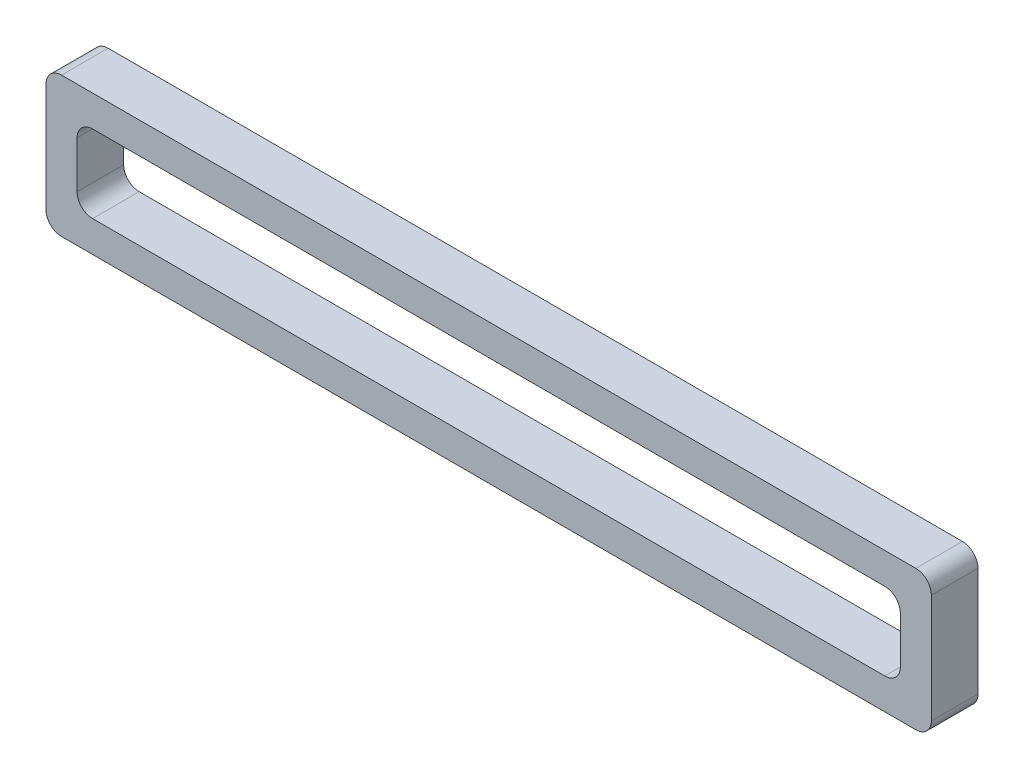
ISO-10303-21;
HEADER;
FILE_DESCRIPTION(('STEP AP214'),'2;1');
FILE_NAME('part.step','',(''),(''),'','','');
FILE_SCHEMA(('AUTOMOTIVE_DESIGN { 1 0 10303 214 1 1 1 1 }'));
ENDSEC;
DATA;
#1=APPLICATION_CONTEXT('core data for automotive mechanical design processes');
#2=APPLICATION_PROTOCOL_DEFINITION('international standard','automotive_design',2000,#1);
#3=PRODUCT_CONTEXT('',#1,'mechanical');
#4=PRODUCT('Part','Part','',(#3));
#5=PRODUCT_RELATED_PRODUCT_CATEGORY('part','',(#4));
#6=PRODUCT_DEFINITION_FORMATION('','',#4);
#7=PRODUCT_DEFINITION_CONTEXT('part definition',#1,'design');
#8=PRODUCT_DEFINITION('design','',#6,#7);
#9=PRODUCT_DEFINITION_SHAPE('','',#8);
#10=(LENGTH_UNIT() NAMED_UNIT(*) SI_UNIT(.MILLI.,.METRE.));
#11=(NAMED_UNIT(*) PLANE_ANGLE_UNIT() SI_UNIT($,.RADIAN.));
#12=(NAMED_UNIT(*) SI_UNIT($,.STERADIAN.) SOLID_ANGLE_UNIT());
#13=UNCERTAINTY_MEASURE_WITH_UNIT(LENGTH_MEASURE(1.E-05),#10,'distance_accuracy_value','');
#14=(GEOMETRIC_REPRESENTATION_CONTEXT(3) GLOBAL_UNCERTAINTY_ASSIGNED_CONTEXT((#13)) GLOBAL_UNIT_ASSIGNED_CONTEXT((#10,
#11,#12)) REPRESENTATION_CONTEXT('',''));
#15=CARTESIAN_POINT('',(0.,0.,0.));
#16=DIRECTION('',(0.,0.,1.));
#17=DIRECTION('',(1.,0.,0.));
#18=AXIS2_PLACEMENT_3D('',#15,#16,#17);
#19=CARTESIAN_POINT('',(27.5,-3.5,3.));
#20=DIRECTION('',(0.,0.,1.));
#21=DIRECTION('',(1.,0.,0.));
#22=AXIS2_PLACEMENT_3D('',#19,#20,#21);
#23=PLANE('',#22);
#24=CARTESIAN_POINT('',(27.5,-3.5,3.));
#25=DIRECTION('',(0.,0.,1.));
#26=DIRECTION('',(1.,0.,0.));
#27=AXIS2_PLACEMENT_3D('',#24,#25,#26);
#28=CIRCLE('',#27,0.999999999999997);
#29=CARTESIAN_POINT('',(27.5,-4.5,3.));
#30=VERTEX_POINT('',#29);
#31=CARTESIAN_POINT('',(28.5,-3.5,3.));
#32=VERTEX_POINT('',#31);
#33=EDGE_CURVE('E211',#30,#32,#28,.T.);
#34=ORIENTED_EDGE('',*,*,#33,.T.);
#35=DIRECTION('',(0.,1.,0.));
#36=VECTOR('',#35,1.);
#37=CARTESIAN_POINT('',(28.5,3.5,3.));
#38=LINE('',#37,#36);
#39=CARTESIAN_POINT('',(28.5,3.5,3.));
#40=VERTEX_POINT('',#39);
#41=EDGE_CURVE('E214',#32,#40,#38,.T.);
#42=ORIENTED_EDGE('',*,*,#41,.T.);
#43=CARTESIAN_POINT('',(27.5,3.5,3.));
#44=DIRECTION('',(0.,0.,1.));
#45=DIRECTION('',(-1.,0.,0.));
#46=AXIS2_PLACEMENT_3D('',#43,#44,#45);
#47=CIRCLE('',#46,1.);
#48=CARTESIAN_POINT('',(27.5,4.5,3.));
#49=VERTEX_POINT('',#48);
#50=EDGE_CURVE('E217',#40,#49,#47,.T.);
#51=ORIENTED_EDGE('',*,*,#50,.T.);
#52=DIRECTION('',(-1.,0.,0.));
#53=VECTOR('',#52,1.);
#54=CARTESIAN_POINT('',(-27.5,4.5,3.));
#55=LINE('',#54,#53);
#56=CARTESIAN_POINT('',(-27.5,4.5,3.));
#57=VERTEX_POINT('',#56);
#58=EDGE_CURVE('E219',#49,#57,#55,.T.);
#59=ORIENTED_EDGE('',*,*,#58,.T.);
#60=CARTESIAN_POINT('',(-27.5,3.5,3.));
#61=DIRECTION('',(0.,0.,1.));
#62=DIRECTION('',(1.,0.,0.));
#63=AXIS2_PLACEMENT_3D('',#60,#61,#62);
#64=CIRCLE('',#63,0.999999999999999);
#65=CARTESIAN_POINT('',(-28.5,3.5,3.));
#66=VERTEX_POINT('',#65);
#67=EDGE_CURVE('E221',#57,#66,#64,.T.);
#68=ORIENTED_EDGE('',*,*,#67,.T.);
#69=DIRECTION('',(0.,-1.,0.));
#70=VECTOR('',#69,1.);
#71=CARTESIAN_POINT('',(-28.5,3.5,3.));
#72=LINE('',#71,#70);
#73=CARTESIAN_POINT('',(-28.5,-3.5,3.));
#74=VERTEX_POINT('',#73);
#75=EDGE_CURVE('E223',#66,#74,#72,.T.);
#76=ORIENTED_EDGE('',*,*,#75,.T.);
#77=CARTESIAN_POINT('',(-27.5,-3.5,3.));
#78=DIRECTION('',(0.,0.,1.));
#79=DIRECTION('',(1.,0.,0.));
#80=AXIS2_PLACEMENT_3D('',#77,#78,#79);
#81=CIRCLE('',#80,0.999999999999999);
#82=CARTESIAN_POINT('',(-27.5,-4.5,3.));
#83=VERTEX_POINT('',#82);
#84=EDGE_CURVE('E225',#74,#83,#81,.T.);
#85=ORIENTED_EDGE('',*,*,#84,.T.);
#86=DIRECTION('',(1.,0.,0.));
#87=VECTOR('',#86,1.);
#88=CARTESIAN_POINT('',(-27.5,-4.5,3.));
#89=LINE('',#88,#87);
#90=EDGE_CURVE('E227',#83,#30,#89,.T.);
#91=ORIENTED_EDGE('',*,*,#90,.T.);
#92=EDGE_LOOP('',(#34,#42,#51,#59,#68,#76,#85,#91));
#93=FACE_BOUND('',#92,.T.);
#94=DIRECTION('',(-1.,0.,0.));
#95=VECTOR('',#94,1.);
#96=CARTESIAN_POINT('',(-25.5,2.5,3.));
#97=LINE('',#96,#95);
#98=CARTESIAN_POINT('',(25.5,2.5,3.));
#99=VERTEX_POINT('',#98);
#100=CARTESIAN_POINT('',(-25.5,2.5,3.));
#101=VERTEX_POINT('',#100);
#102=EDGE_CURVE('E154',#99,#101,#97,.T.);
#103=ORIENTED_EDGE('',*,*,#102,.F.);
#104=CARTESIAN_POINT('',(25.5,1.5,3.));
#105=DIRECTION('',(0.,0.,1.));
#106=DIRECTION('',(-1.,0.,0.));
#107=AXIS2_PLACEMENT_3D('',#104,#105,#106);
#108=CIRCLE('',#107,0.999999999999999);
#109=CARTESIAN_POINT('',(26.5,1.5,3.));
#110=VERTEX_POINT('',#109);
#111=EDGE_CURVE('E146',#110,#99,#108,.T.);
#112=ORIENTED_EDGE('',*,*,#111,.F.);
#113=DIRECTION('',(0.,1.,0.));
#114=VECTOR('',#113,1.);
#115=CARTESIAN_POINT('',(26.5,1.5,3.));
#116=LINE('',#115,#114);
#117=CARTESIAN_POINT('',(26.5,-1.5,3.));
#118=VERTEX_POINT('',#117);
#119=EDGE_CURVE('E179',#118,#110,#116,.T.);
#120=ORIENTED_EDGE('',*,*,#119,.F.);
#121=CARTESIAN_POINT('',(25.5,-1.5,3.));
#122=DIRECTION('',(0.,0.,1.));
#123=DIRECTION('',(1.,0.,0.));
#124=AXIS2_PLACEMENT_3D('',#121,#122,#123);
#125=CIRCLE('',#124,0.999999999999999);
#126=CARTESIAN_POINT('',(25.5,-2.5,3.));
#127=VERTEX_POINT('',#126);
#128=EDGE_CURVE('E177',#127,#118,#125,.T.);
#129=ORIENTED_EDGE('',*,*,#128,.F.);
#130=DIRECTION('',(1.,0.,0.));
#131=VECTOR('',#130,1.);
#132=CARTESIAN_POINT('',(-25.5,-2.5,3.));
#133=LINE('',#132,#131);
#134=CARTESIAN_POINT('',(-25.5,-2.5,3.));
#135=VERTEX_POINT('',#134);
#136=EDGE_CURVE('E175',#135,#127,#133,.T.);
#137=ORIENTED_EDGE('',*,*,#136,.F.);
#138=CARTESIAN_POINT('',(-25.5,-1.5,3.));
#139=DIRECTION('',(0.,0.,1.));
#140=DIRECTION('',(1.,0.,0.));
#141=AXIS2_PLACEMENT_3D('',#138,#139,#140);
#142=CIRCLE('',#141,1.);
#143=CARTESIAN_POINT('',(-26.5,-1.5,3.));
#144=VERTEX_POINT('',#143);
#145=EDGE_CURVE('E173',#144,#135,#142,.T.);
#146=ORIENTED_EDGE('',*,*,#145,.F.);
#147=DIRECTION('',(0.,-1.,0.));
#148=VECTOR('',#147,1.);
#149=CARTESIAN_POINT('',(-26.5,1.5,3.));
#150=LINE('',#149,#148);
#151=CARTESIAN_POINT('',(-26.5,1.5,3.));
#152=VERTEX_POINT('',#151);
#153=EDGE_CURVE('E169',#152,#144,#150,.T.);
#154=ORIENTED_EDGE('',*,*,#153,.F.);
#155=CARTESIAN_POINT('',(-25.5,1.5,3.));
#156=DIRECTION('',(0.,0.,1.));
#157=DIRECTION('',(1.,0.,0.));
#158=AXIS2_PLACEMENT_3D('',#155,#156,#157);
#159=CIRCLE('',#158,1.);
#160=EDGE_CURVE('E167',#101,#152,#159,.T.);
#161=ORIENTED_EDGE('',*,*,#160,.F.);
#162=EDGE_LOOP('',(#103,#112,#120,#129,#137,#146,#154,#161));
#163=FACE_BOUND('',#162,.T.);
#164=ADVANCED_FACE('F33',(#93,#163),#23,.T.);
#165=CARTESIAN_POINT('',(27.5,-3.5,0.));
#166=DIRECTION('',(0.,0.,1.));
#167=DIRECTION('',(1.,0.,0.));
#168=AXIS2_PLACEMENT_3D('',#165,#166,#167);
#169=PLANE('',#168);
#170=CARTESIAN_POINT('',(27.5,-3.5,0.));
#171=DIRECTION('',(0.,0.,1.));
#172=DIRECTION('',(1.,0.,0.));
#173=AXIS2_PLACEMENT_3D('',#170,#171,#172);
#174=CIRCLE('',#173,0.999999999999997);
#175=CARTESIAN_POINT('',(27.5,-4.5,0.));
#176=VERTEX_POINT('',#175);
#177=CARTESIAN_POINT('',(28.5,-3.5,0.));
#178=VERTEX_POINT('',#177);
#179=EDGE_CURVE('E162',#176,#178,#174,.T.);
#180=ORIENTED_EDGE('',*,*,#179,.F.);
#181=DIRECTION('',(1.,0.,0.));
#182=VECTOR('',#181,1.);
#183=CARTESIAN_POINT('',(-27.5,-4.5,0.));
#184=LINE('',#183,#182);
#185=CARTESIAN_POINT('',(-27.5,-4.5,0.));
#186=VERTEX_POINT('',#185);
#187=EDGE_CURVE('E215',#186,#176,#184,.T.);
#188=ORIENTED_EDGE('',*,*,#187,.F.);
#189=CARTESIAN_POINT('',(-27.5,-3.5,0.));
#190=DIRECTION('',(0.,0.,1.));
#191=DIRECTION('',(1.,0.,0.));
#192=AXIS2_PLACEMENT_3D('',#189,#190,#191);
#193=CIRCLE('',#192,0.999999999999999);
#194=CARTESIAN_POINT('',(-28.5,-3.5,0.));
#195=VERTEX_POINT('',#194);
#196=EDGE_CURVE('E242',#195,#186,#193,.T.);
#197=ORIENTED_EDGE('',*,*,#196,.F.);
#198=DIRECTION('',(0.,-1.,0.));
#199=VECTOR('',#198,1.);
#200=CARTESIAN_POINT('',(-28.5,3.5,0.));
#201=LINE('',#200,#199);
#202=CARTESIAN_POINT('',(-28.5,3.5,0.));
#203=VERTEX_POINT('',#202);
#204=EDGE_CURVE('E240',#203,#195,#201,.T.);
#205=ORIENTED_EDGE('',*,*,#204,.F.);
#206=CARTESIAN_POINT('',(-27.5,3.5,0.));
#207=DIRECTION('',(0.,0.,1.));
#208=DIRECTION('',(1.,0.,0.));
#209=AXIS2_PLACEMENT_3D('',#206,#207,#208);
#210=CIRCLE('',#209,0.999999999999999);
#211=CARTESIAN_POINT('',(-27.5,4.5,0.));
#212=VERTEX_POINT('',#211);
#213=EDGE_CURVE('E238',#212,#203,#210,.T.);
#214=ORIENTED_EDGE('',*,*,#213,.F.);
#215=DIRECTION('',(-1.,0.,0.));
#216=VECTOR('',#215,1.);
#217=CARTESIAN_POINT('',(-27.5,4.5,0.));
#218=LINE('',#217,#216);
#219=CARTESIAN_POINT('',(27.5,4.5,0.));
#220=VERTEX_POINT('',#219);
#221=EDGE_CURVE('E236',#220,#212,#218,.T.);
#222=ORIENTED_EDGE('',*,*,#221,.F.);
#223=CARTESIAN_POINT('',(27.5,3.5,0.));
#224=DIRECTION('',(0.,0.,1.));
#225=DIRECTION('',(-1.,0.,0.));
#226=AXIS2_PLACEMENT_3D('',#223,#224,#225);
#227=CIRCLE('',#226,1.);
#228=CARTESIAN_POINT('',(28.5,3.5,0.));
#229=VERTEX_POINT('',#228);
#230=EDGE_CURVE('E234',#229,#220,#227,.T.);
#231=ORIENTED_EDGE('',*,*,#230,.F.);
#232=DIRECTION('',(0.,1.,0.));
#233=VECTOR('',#232,1.);
#234=CARTESIAN_POINT('',(28.5,3.5,0.));
#235=LINE('',#234,#233);
#236=EDGE_CURVE('E232',#178,#229,#235,.T.);
#237=ORIENTED_EDGE('',*,*,#236,.F.);
#238=EDGE_LOOP('',(#180,#188,#197,#205,#214,#222,#231,#237));
#239=FACE_BOUND('',#238,.T.);
#240=CARTESIAN_POINT('',(25.5,1.5,0.));
#241=DIRECTION('',(0.,0.,1.));
#242=DIRECTION('',(-1.,0.,0.));
#243=AXIS2_PLACEMENT_3D('',#240,#241,#242);
#244=CIRCLE('',#243,0.999999999999999);
#245=CARTESIAN_POINT('',(26.5,1.5,0.));
#246=VERTEX_POINT('',#245);
#247=CARTESIAN_POINT('',(25.5,2.5,0.));
#248=VERTEX_POINT('',#247);
#249=EDGE_CURVE('E56',#246,#248,#244,.T.);
#250=ORIENTED_EDGE('',*,*,#249,.T.);
#251=DIRECTION('',(-1.,0.,0.));
#252=VECTOR('',#251,1.);
#253=CARTESIAN_POINT('',(-25.5,2.5,0.));
#254=LINE('',#253,#252);
#255=CARTESIAN_POINT('',(-25.5,2.5,0.));
#256=VERTEX_POINT('',#255);
#257=EDGE_CURVE('E161',#248,#256,#254,.T.);
#258=ORIENTED_EDGE('',*,*,#257,.T.);
#259=CARTESIAN_POINT('',(-25.5,1.5,0.));
#260=DIRECTION('',(0.,0.,1.));
#261=DIRECTION('',(1.,0.,0.));
#262=AXIS2_PLACEMENT_3D('',#259,#260,#261);
#263=CIRCLE('',#262,1.);
#264=CARTESIAN_POINT('',(-26.5,1.5,0.));
#265=VERTEX_POINT('',#264);
#266=EDGE_CURVE('E183',#256,#265,#263,.T.);
#267=ORIENTED_EDGE('',*,*,#266,.T.);
#268=DIRECTION('',(0.,-1.,0.));
#269=VECTOR('',#268,1.);
#270=CARTESIAN_POINT('',(-26.5,1.5,0.));
#271=LINE('',#270,#269);
#272=CARTESIAN_POINT('',(-26.5,-1.5,0.));
#273=VERTEX_POINT('',#272);
#274=EDGE_CURVE('E186',#265,#273,#271,.T.);
#275=ORIENTED_EDGE('',*,*,#274,.T.);
#276=CARTESIAN_POINT('',(-25.5,-1.5,0.));
#277=DIRECTION('',(0.,0.,1.));
#278=DIRECTION('',(1.,0.,0.));
#279=AXIS2_PLACEMENT_3D('',#276,#277,#278);
#280=CIRCLE('',#279,1.);
#281=CARTESIAN_POINT('',(-25.5,-2.5,0.));
#282=VERTEX_POINT('',#281);
#283=EDGE_CURVE('E189',#273,#282,#280,.T.);
#284=ORIENTED_EDGE('',*,*,#283,.T.);
#285=DIRECTION('',(1.,0.,0.));
#286=VECTOR('',#285,1.);
#287=CARTESIAN_POINT('',(-25.5,-2.5,0.));
#288=LINE('',#287,#286);
#289=CARTESIAN_POINT('',(25.5,-2.5,0.));
#290=VERTEX_POINT('',#289);
#291=EDGE_CURVE('E192',#282,#290,#288,.T.);
#292=ORIENTED_EDGE('',*,*,#291,.T.);
#293=CARTESIAN_POINT('',(25.5,-1.5,0.));
#294=DIRECTION('',(0.,0.,1.));
#295=DIRECTION('',(1.,0.,0.));
#296=AXIS2_PLACEMENT_3D('',#293,#294,#295);
#297=CIRCLE('',#296,0.999999999999999);
#298=CARTESIAN_POINT('',(26.5,-1.5,0.));
#299=VERTEX_POINT('',#298);
#300=EDGE_CURVE('E195',#290,#299,#297,.T.);
#301=ORIENTED_EDGE('',*,*,#300,.T.);
#302=DIRECTION('',(0.,1.,0.));
#303=VECTOR('',#302,1.);
#304=CARTESIAN_POINT('',(26.5,1.5,0.));
#305=LINE('',#304,#303);
#306=EDGE_CURVE('E155',#299,#246,#305,.T.);
#307=ORIENTED_EDGE('',*,*,#306,.T.);
#308=EDGE_LOOP('',(#250,#258,#267,#275,#284,#292,#301,#307));
#309=FACE_BOUND('',#308,.T.);
#310=ADVANCED_FACE('F272',(#239,#309),#169,.F.);
#311=CARTESIAN_POINT('',(27.5,-3.5,3.));
#312=DIRECTION('',(0.,0.,-1.));
#313=DIRECTION('',(-1.,0.,0.));
#314=AXIS2_PLACEMENT_3D('',#311,#312,#313);
#315=CYLINDRICAL_SURFACE('',#314,0.999999999999997);
#316=ORIENTED_EDGE('',*,*,#179,.T.);
#317=DIRECTION('',(0.,0.,-1.));
#318=VECTOR('',#317,1.);
#319=CARTESIAN_POINT('',(28.5,-3.5,3.));
#320=LINE('',#319,#318);
#321=EDGE_CURVE('E11',#32,#178,#320,.T.);
#322=ORIENTED_EDGE('',*,*,#321,.F.);
#323=ORIENTED_EDGE('',*,*,#33,.F.);
#324=DIRECTION('',(0.,0.,-1.));
#325=VECTOR('',#324,1.);
#326=CARTESIAN_POINT('',(27.5,-4.5,3.));
#327=LINE('',#326,#325);
#328=EDGE_CURVE('E229',#30,#176,#327,.T.);
#329=ORIENTED_EDGE('',*,*,#328,.T.);
#330=EDGE_LOOP('',(#316,#322,#323,#329));
#331=FACE_BOUND('',#330,.T.);
#332=ADVANCED_FACE('F35',(#331),#315,.T.);
#333=CARTESIAN_POINT('',(28.5,3.5,3.));
#334=DIRECTION('',(-1.,0.,0.));
#335=DIRECTION('',(0.,-1.,0.));
#336=AXIS2_PLACEMENT_3D('',#333,#334,#335);
#337=PLANE('',#336);
#338=ORIENTED_EDGE('',*,*,#236,.T.);
#339=DIRECTION('',(0.,0.,-1.));
#340=VECTOR('',#339,1.);
#341=CARTESIAN_POINT('',(28.5,3.5,3.));
#342=LINE('',#341,#340);
#343=EDGE_CURVE('E41',#40,#229,#342,.T.);
#344=ORIENTED_EDGE('',*,*,#343,.F.);
#345=ORIENTED_EDGE('',*,*,#41,.F.);
#346=ORIENTED_EDGE('',*,*,#321,.T.);
#347=EDGE_LOOP('',(#338,#344,#345,#346));
#348=FACE_BOUND('',#347,.T.);
#349=ADVANCED_FACE('F289',(#348),#337,.F.);
#350=CARTESIAN_POINT('',(27.5,3.5,3.));
#351=DIRECTION('',(0.,0.,-1.));
#352=DIRECTION('',(-1.,0.,0.));
#353=AXIS2_PLACEMENT_3D('',#350,#351,#352);
#354=CYLINDRICAL_SURFACE('',#353,1.);
#355=ORIENTED_EDGE('',*,*,#230,.T.);
#356=DIRECTION('',(0.,0.,-1.));
#357=VECTOR('',#356,1.);
#358=CARTESIAN_POINT('',(27.5,4.5,3.));
#359=LINE('',#358,#357);
#360=EDGE_CURVE('E259',#49,#220,#359,.T.);
#361=ORIENTED_EDGE('',*,*,#360,.F.);
#362=ORIENTED_EDGE('',*,*,#50,.F.);
#363=ORIENTED_EDGE('',*,*,#343,.T.);
#364=EDGE_LOOP('',(#355,#361,#362,#363));
#365=FACE_BOUND('',#364,.T.);
#366=ADVANCED_FACE('F266',(#365),#354,.T.);
#367=CARTESIAN_POINT('',(-27.5,4.5,3.));
#368=DIRECTION('',(0.,-1.,0.));
#369=DIRECTION('',(0.,0.,-1.));
#370=AXIS2_PLACEMENT_3D('',#367,#368,#369);
#371=PLANE('',#370);
#372=ORIENTED_EDGE('',*,*,#221,.T.);
#373=DIRECTION('',(0.,0.,-1.));
#374=VECTOR('',#373,1.);
#375=CARTESIAN_POINT('',(-27.5,4.5,3.));
#376=LINE('',#375,#374);
#377=EDGE_CURVE('E256',#57,#212,#376,.T.);
#378=ORIENTED_EDGE('',*,*,#377,.F.);
#379=ORIENTED_EDGE('',*,*,#58,.F.);
#380=ORIENTED_EDGE('',*,*,#360,.T.);
#381=EDGE_LOOP('',(#372,#378,#379,#380));
#382=FACE_BOUND('',#381,.T.);
#383=ADVANCED_FACE('F278',(#382),#371,.F.);
#384=CARTESIAN_POINT('',(-27.5,3.5,3.));
#385=DIRECTION('',(0.,0.,-1.));
#386=DIRECTION('',(-1.,0.,0.));
#387=AXIS2_PLACEMENT_3D('',#384,#385,#386);
#388=CYLINDRICAL_SURFACE('',#387,0.999999999999999);
#389=ORIENTED_EDGE('',*,*,#213,.T.);
#390=DIRECTION('',(0.,0.,-1.));
#391=VECTOR('',#390,1.);
#392=CARTESIAN_POINT('',(-28.5,3.5,3.));
#393=LINE('',#392,#391);
#394=EDGE_CURVE('E253',#66,#203,#393,.T.);
#395=ORIENTED_EDGE('',*,*,#394,.F.);
#396=ORIENTED_EDGE('',*,*,#67,.F.);
#397=ORIENTED_EDGE('',*,*,#377,.T.);
#398=EDGE_LOOP('',(#389,#395,#396,#397));
#399=FACE_BOUND('',#398,.T.);
#400=ADVANCED_FACE('F282',(#399),#388,.T.);
#401=CARTESIAN_POINT('',(-28.5,3.5,3.));
#402=DIRECTION('',(1.,0.,0.));
#403=DIRECTION('',(0.,0.,-1.));
#404=AXIS2_PLACEMENT_3D('',#401,#402,#403);
#405=PLANE('',#404);
#406=ORIENTED_EDGE('',*,*,#204,.T.);
#407=DIRECTION('',(0.,0.,-1.));
#408=VECTOR('',#407,1.);
#409=CARTESIAN_POINT('',(-28.5,-3.5,3.));
#410=LINE('',#409,#408);
#411=EDGE_CURVE('E250',#74,#195,#410,.T.);
#412=ORIENTED_EDGE('',*,*,#411,.F.);
#413=ORIENTED_EDGE('',*,*,#75,.F.);
#414=ORIENTED_EDGE('',*,*,#394,.T.);
#415=EDGE_LOOP('',(#406,#412,#413,#414));
#416=FACE_BOUND('',#415,.T.);
#417=ADVANCED_FACE('F302',(#416),#405,.F.);
#418=CARTESIAN_POINT('',(-27.5,-3.5,3.));
#419=DIRECTION('',(0.,0.,-1.));
#420=DIRECTION('',(-1.,0.,0.));
#421=AXIS2_PLACEMENT_3D('',#418,#419,#420);
#422=CYLINDRICAL_SURFACE('',#421,0.999999999999999);
#423=ORIENTED_EDGE('',*,*,#196,.T.);
#424=DIRECTION('',(0.,0.,-1.));
#425=VECTOR('',#424,1.);
#426=CARTESIAN_POINT('',(-27.5,-4.5,3.));
#427=LINE('',#426,#425);
#428=EDGE_CURVE('E247',#83,#186,#427,.T.);
#429=ORIENTED_EDGE('',*,*,#428,.F.);
#430=ORIENTED_EDGE('',*,*,#84,.F.);
#431=ORIENTED_EDGE('',*,*,#411,.T.);
#432=EDGE_LOOP('',(#423,#429,#430,#431));
#433=FACE_BOUND('',#432,.T.);
#434=ADVANCED_FACE('F300',(#433),#422,.T.);
#435=CARTESIAN_POINT('',(-27.5,-4.5,3.));
#436=DIRECTION('',(0.,1.,0.));
#437=DIRECTION('',(0.,0.,1.));
#438=AXIS2_PLACEMENT_3D('',#435,#436,#437);
#439=PLANE('',#438);
#440=ORIENTED_EDGE('',*,*,#187,.T.);
#441=ORIENTED_EDGE('',*,*,#328,.F.);
#442=ORIENTED_EDGE('',*,*,#90,.F.);
#443=ORIENTED_EDGE('',*,*,#428,.T.);
#444=EDGE_LOOP('',(#440,#441,#442,#443));
#445=FACE_BOUND('',#444,.T.);
#446=ADVANCED_FACE('F295',(#445),#439,.F.);
#447=CARTESIAN_POINT('',(25.5,1.5,3.));
#448=DIRECTION('',(0.,0.,-1.));
#449=DIRECTION('',(-1.,0.,0.));
#450=AXIS2_PLACEMENT_3D('',#447,#448,#449);
#451=CYLINDRICAL_SURFACE('',#450,0.999999999999999);
#452=ORIENTED_EDGE('',*,*,#249,.F.);
#453=DIRECTION('',(0.,0.,-1.));
#454=VECTOR('',#453,1.);
#455=CARTESIAN_POINT('',(26.5,1.5,3.));
#456=LINE('',#455,#454);
#457=EDGE_CURVE('E150',#110,#246,#456,.T.);
#458=ORIENTED_EDGE('',*,*,#457,.F.);
#459=ORIENTED_EDGE('',*,*,#111,.T.);
#460=DIRECTION('',(0.,0.,-1.));
#461=VECTOR('',#460,1.);
#462=CARTESIAN_POINT('',(25.5,2.5,3.));
#463=LINE('',#462,#461);
#464=EDGE_CURVE('E149',#99,#248,#463,.T.);
#465=ORIENTED_EDGE('',*,*,#464,.T.);
#466=EDGE_LOOP('',(#452,#458,#459,#465));
#467=FACE_BOUND('',#466,.T.);
#468=ADVANCED_FACE('F148',(#467),#451,.F.);
#469=CARTESIAN_POINT('',(-25.5,2.5,3.));
#470=DIRECTION('',(0.,-1.,0.));
#471=DIRECTION('',(1.,0.,0.));
#472=AXIS2_PLACEMENT_3D('',#469,#470,#471);
#473=PLANE('',#472);
#474=ORIENTED_EDGE('',*,*,#257,.F.);
#475=ORIENTED_EDGE('',*,*,#464,.F.);
#476=ORIENTED_EDGE('',*,*,#102,.T.);
#477=DIRECTION('',(0.,0.,-1.));
#478=VECTOR('',#477,1.);
#479=CARTESIAN_POINT('',(-25.5,2.5,3.));
#480=LINE('',#479,#478);
#481=EDGE_CURVE('E163',#101,#256,#480,.T.);
#482=ORIENTED_EDGE('',*,*,#481,.T.);
#483=EDGE_LOOP('',(#474,#475,#476,#482));
#484=FACE_BOUND('',#483,.T.);
#485=ADVANCED_FACE('F158',(#484),#473,.T.);
#486=CARTESIAN_POINT('',(-25.5,1.5,3.));
#487=DIRECTION('',(0.,0.,-1.));
#488=DIRECTION('',(-1.,0.,0.));
#489=AXIS2_PLACEMENT_3D('',#486,#487,#488);
#490=CYLINDRICAL_SURFACE('',#489,1.);
#491=ORIENTED_EDGE('',*,*,#266,.F.);
#492=ORIENTED_EDGE('',*,*,#481,.F.);
#493=ORIENTED_EDGE('',*,*,#160,.T.);
#494=DIRECTION('',(0.,0.,-1.));
#495=VECTOR('',#494,1.);
#496=CARTESIAN_POINT('',(-26.5,1.5,3.));
#497=LINE('',#496,#495);
#498=EDGE_CURVE('E208',#152,#265,#497,.T.);
#499=ORIENTED_EDGE('',*,*,#498,.T.);
#500=EDGE_LOOP('',(#491,#492,#493,#499));
#501=FACE_BOUND('',#500,.T.);
#502=ADVANCED_FACE('F327',(#501),#490,.F.);
#503=CARTESIAN_POINT('',(-26.5,1.5,3.));
#504=DIRECTION('',(1.,0.,0.));
#505=DIRECTION('',(0.,1.,0.));
#506=AXIS2_PLACEMENT_3D('',#503,#504,#505);
#507=PLANE('',#506);
#508=ORIENTED_EDGE('',*,*,#274,.F.);
#509=ORIENTED_EDGE('',*,*,#498,.F.);
#510=ORIENTED_EDGE('',*,*,#153,.T.);
#511=DIRECTION('',(0.,0.,-1.));
#512=VECTOR('',#511,1.);
#513=CARTESIAN_POINT('',(-26.5,-1.5,3.));
#514=LINE('',#513,#512);
#515=EDGE_CURVE('E206',#144,#273,#514,.T.);
#516=ORIENTED_EDGE('',*,*,#515,.T.);
#517=EDGE_LOOP('',(#508,#509,#510,#516));
#518=FACE_BOUND('',#517,.T.);
#519=ADVANCED_FACE('F331',(#518),#507,.T.);
#520=CARTESIAN_POINT('',(-25.5,-1.5,3.));
#521=DIRECTION('',(0.,0.,-1.));
#522=DIRECTION('',(-1.,0.,0.));
#523=AXIS2_PLACEMENT_3D('',#520,#521,#522);
#524=CYLINDRICAL_SURFACE('',#523,1.);
#525=ORIENTED_EDGE('',*,*,#283,.F.);
#526=ORIENTED_EDGE('',*,*,#515,.F.);
#527=ORIENTED_EDGE('',*,*,#145,.T.);
#528=DIRECTION('',(0.,0.,-1.));
#529=VECTOR('',#528,1.);
#530=CARTESIAN_POINT('',(-25.5,-2.5,3.));
#531=LINE('',#530,#529);
#532=EDGE_CURVE('E204',#135,#282,#531,.T.);
#533=ORIENTED_EDGE('',*,*,#532,.T.);
#534=EDGE_LOOP('',(#525,#526,#527,#533));
#535=FACE_BOUND('',#534,.T.);
#536=ADVANCED_FACE('F337',(#535),#524,.F.);
#537=CARTESIAN_POINT('',(-25.5,-2.5,3.));
#538=DIRECTION('',(0.,1.,0.));
#539=DIRECTION('',(0.,0.,1.));
#540=AXIS2_PLACEMENT_3D('',#537,#538,#539);
#541=PLANE('',#540);
#542=ORIENTED_EDGE('',*,*,#291,.F.);
#543=ORIENTED_EDGE('',*,*,#532,.F.);
#544=ORIENTED_EDGE('',*,*,#136,.T.);
#545=DIRECTION('',(0.,0.,-1.));
#546=VECTOR('',#545,1.);
#547=CARTESIAN_POINT('',(25.5,-2.5,3.));
#548=LINE('',#547,#546);
#549=EDGE_CURVE('E202',#127,#290,#548,.T.);
#550=ORIENTED_EDGE('',*,*,#549,.T.);
#551=EDGE_LOOP('',(#542,#543,#544,#550));
#552=FACE_BOUND('',#551,.T.);
#553=ADVANCED_FACE('F341',(#552),#541,.T.);
#554=CARTESIAN_POINT('',(25.5,-1.5,3.));
#555=DIRECTION('',(0.,0.,-1.));
#556=DIRECTION('',(-1.,0.,0.));
#557=AXIS2_PLACEMENT_3D('',#554,#555,#556);
#558=CYLINDRICAL_SURFACE('',#557,0.999999999999999);
#559=ORIENTED_EDGE('',*,*,#300,.F.);
#560=ORIENTED_EDGE('',*,*,#549,.F.);
#561=ORIENTED_EDGE('',*,*,#128,.T.);
#562=DIRECTION('',(0.,0.,-1.));
#563=VECTOR('',#562,1.);
#564=CARTESIAN_POINT('',(26.5,-1.5,3.));
#565=LINE('',#564,#563);
#566=EDGE_CURVE('E48',#118,#299,#565,.T.);
#567=ORIENTED_EDGE('',*,*,#566,.T.);
#568=EDGE_LOOP('',(#559,#560,#561,#567));
#569=FACE_BOUND('',#568,.T.);
#570=ADVANCED_FACE('F345',(#569),#558,.F.);
#571=CARTESIAN_POINT('',(26.5,1.5,3.));
#572=DIRECTION('',(-1.,0.,0.));
#573=DIRECTION('',(0.,0.,1.));
#574=AXIS2_PLACEMENT_3D('',#571,#572,#573);
#575=PLANE('',#574);
#576=ORIENTED_EDGE('',*,*,#306,.F.);
#577=ORIENTED_EDGE('',*,*,#566,.F.);
#578=ORIENTED_EDGE('',*,*,#119,.T.);
#579=ORIENTED_EDGE('',*,*,#457,.T.);
#580=EDGE_LOOP('',(#576,#577,#578,#579));
#581=FACE_BOUND('',#580,.T.);
#582=ADVANCED_FACE('F349',(#581),#575,.T.);
#583=CLOSED_SHELL('',(#164,#310,#332,#349,#366,#383,#400,#417,#434,#446,#468,#485,#502,#519,
#536,#553,#570,#582));
#584=MANIFOLD_SOLID_BREP('B2',#583);
#585=ADVANCED_BREP_SHAPE_REPRESENTATION('',(#18,#584),#14);
#586=SHAPE_DEFINITION_REPRESENTATION(#9,#585);
ENDSEC;
END-ISO-10303-21;
